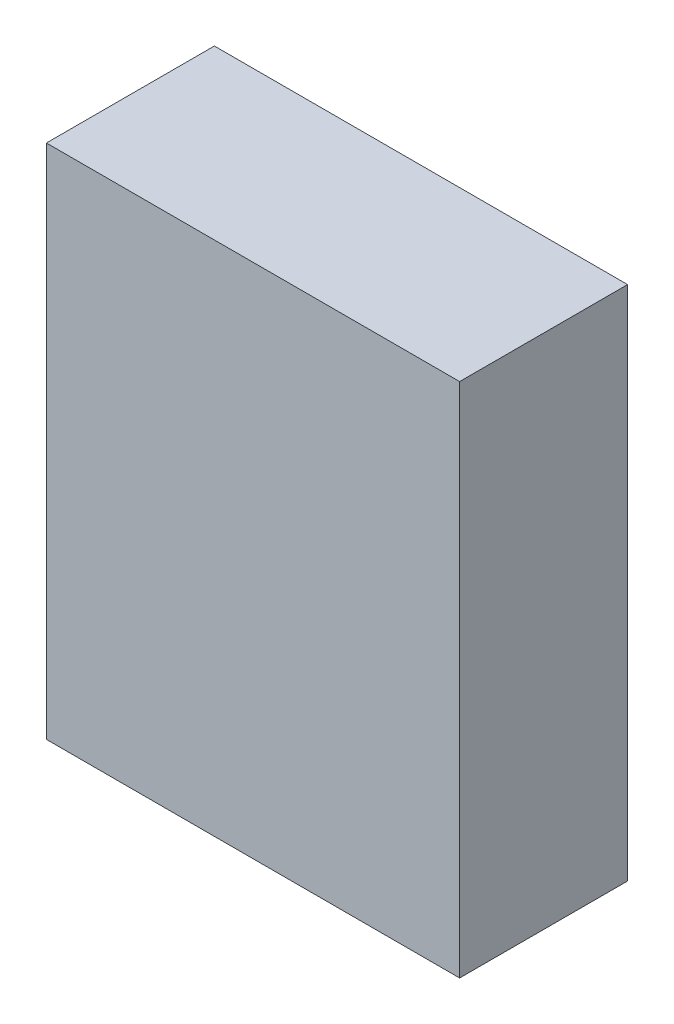
ISO-10303-21;
HEADER;
FILE_DESCRIPTION(('STEP AP214'),'2;1');
FILE_NAME('part.step','',(''),(''),'','','');
FILE_SCHEMA(('AUTOMOTIVE_DESIGN { 1 0 10303 214 1 1 1 1 }'));
ENDSEC;
DATA;
#1=APPLICATION_CONTEXT('core data for automotive mechanical design processes');
#2=APPLICATION_PROTOCOL_DEFINITION('international standard','automotive_design',2000,#1);
#3=PRODUCT_CONTEXT('',#1,'mechanical');
#4=PRODUCT('Part','Part','',(#3));
#5=PRODUCT_RELATED_PRODUCT_CATEGORY('part','',(#4));
#6=PRODUCT_DEFINITION_FORMATION('','',#4);
#7=PRODUCT_DEFINITION_CONTEXT('part definition',#1,'design');
#8=PRODUCT_DEFINITION('design','',#6,#7);
#9=PRODUCT_DEFINITION_SHAPE('','',#8);
#10=(LENGTH_UNIT() NAMED_UNIT(*) SI_UNIT(.MILLI.,.METRE.));
#11=(NAMED_UNIT(*) PLANE_ANGLE_UNIT() SI_UNIT($,.RADIAN.));
#12=(NAMED_UNIT(*) SI_UNIT($,.STERADIAN.) SOLID_ANGLE_UNIT());
#13=UNCERTAINTY_MEASURE_WITH_UNIT(LENGTH_MEASURE(1.E-05),#10,'distance_accuracy_value','');
#14=(GEOMETRIC_REPRESENTATION_CONTEXT(3) GLOBAL_UNCERTAINTY_ASSIGNED_CONTEXT((#13)) GLOBAL_UNIT_ASSIGNED_CONTEXT((#10,
#11,#12)) REPRESENTATION_CONTEXT('',''));
#15=CARTESIAN_POINT('',(0.,0.,0.));
#16=DIRECTION('',(0.,0.,1.));
#17=DIRECTION('',(1.,0.,0.));
#18=AXIS2_PLACEMENT_3D('',#15,#16,#17);
#19=CARTESIAN_POINT('',(1.23000008,1.5375001,1.00000054));
#20=DIRECTION('',(0.,0.,1.));
#21=DIRECTION('',(1.,0.,0.));
#22=AXIS2_PLACEMENT_3D('',#19,#20,#21);
#23=PLANE('',#22);
#24=DIRECTION('',(1.,0.,0.));
#25=VECTOR('',#24,1.);
#26=CARTESIAN_POINT('',(1.23000008,-1.5375001,1.00000054));
#27=LINE('',#26,#25);
#28=CARTESIAN_POINT('',(1.23000008,-1.5375001,1.00000054));
#29=VERTEX_POINT('',#28);
#30=CARTESIAN_POINT('',(-1.23000008,-1.5375001,1.00000054));
#31=VERTEX_POINT('',#30);
#32=EDGE_CURVE('E52',#29,#31,#27,.F.);
#33=ORIENTED_EDGE('',*,*,#32,.F.);
#34=DIRECTION('',(0.,1.,0.));
#35=VECTOR('',#34,1.);
#36=CARTESIAN_POINT('',(1.23000008,1.5375001,1.00000054));
#37=LINE('',#36,#35);
#38=CARTESIAN_POINT('',(1.23000008,1.5375001,1.00000054));
#39=VERTEX_POINT('',#38);
#40=EDGE_CURVE('E67',#39,#29,#37,.F.);
#41=ORIENTED_EDGE('',*,*,#40,.F.);
#42=DIRECTION('',(1.,0.,0.));
#43=VECTOR('',#42,1.);
#44=CARTESIAN_POINT('',(-1.23000008,1.5375001,1.00000054));
#45=LINE('',#44,#43);
#46=CARTESIAN_POINT('',(-1.23000008,1.5375001,1.00000054));
#47=VERTEX_POINT('',#46);
#48=EDGE_CURVE('E19',#47,#39,#45,.T.);
#49=ORIENTED_EDGE('',*,*,#48,.F.);
#50=DIRECTION('',(0.,1.,0.));
#51=VECTOR('',#50,1.);
#52=CARTESIAN_POINT('',(-1.23000008,-1.5375001,1.00000054));
#53=LINE('',#52,#51);
#54=EDGE_CURVE('E57',#31,#47,#53,.T.);
#55=ORIENTED_EDGE('',*,*,#54,.F.);
#56=EDGE_LOOP('',(#33,#41,#49,#55));
#57=FACE_BOUND('',#56,.T.);
#58=ADVANCED_FACE('F16',(#57),#23,.T.);
#59=CARTESIAN_POINT('',(-1.23000008,1.5375001,0.));
#60=DIRECTION('',(0.,1.,0.));
#61=DIRECTION('',(0.,0.,1.));
#62=AXIS2_PLACEMENT_3D('',#59,#60,#61);
#63=PLANE('',#62);
#64=DIRECTION('',(0.,0.,-1.));
#65=VECTOR('',#64,1.);
#66=CARTESIAN_POINT('',(1.23000008,1.5375001,0.));
#67=LINE('',#66,#65);
#68=CARTESIAN_POINT('',(1.23000008,1.5375001,0.));
#69=VERTEX_POINT('',#68);
#70=EDGE_CURVE('E78',#69,#39,#67,.F.);
#71=ORIENTED_EDGE('',*,*,#70,.F.);
#72=DIRECTION('',(1.,0.,0.));
#73=VECTOR('',#72,1.);
#74=CARTESIAN_POINT('',(1.23000008,1.5375001,0.));
#75=LINE('',#74,#73);
#76=CARTESIAN_POINT('',(-1.23000008,1.5375001,0.));
#77=VERTEX_POINT('',#76);
#78=EDGE_CURVE('E73',#69,#77,#75,.F.);
#79=ORIENTED_EDGE('',*,*,#78,.T.);
#80=DIRECTION('',(0.,0.,1.));
#81=VECTOR('',#80,1.);
#82=CARTESIAN_POINT('',(-1.23000008,1.5375001,0.));
#83=LINE('',#82,#81);
#84=EDGE_CURVE('E62',#47,#77,#83,.F.);
#85=ORIENTED_EDGE('',*,*,#84,.F.);
#86=ORIENTED_EDGE('',*,*,#48,.T.);
#87=EDGE_LOOP('',(#71,#79,#85,#86));
#88=FACE_BOUND('',#87,.T.);
#89=ADVANCED_FACE('F72',(#88),#63,.T.);
#90=CARTESIAN_POINT('',(-1.23000008,-1.5375001,0.));
#91=DIRECTION('',(-1.,0.,0.));
#92=DIRECTION('',(0.,0.,1.));
#93=AXIS2_PLACEMENT_3D('',#90,#91,#92);
#94=PLANE('',#93);
#95=ORIENTED_EDGE('',*,*,#84,.T.);
#96=DIRECTION('',(0.,1.,0.));
#97=VECTOR('',#96,1.);
#98=CARTESIAN_POINT('',(-1.23000008,1.5375001,0.));
#99=LINE('',#98,#97);
#100=CARTESIAN_POINT('',(-1.23000008,-1.5375001,0.));
#101=VERTEX_POINT('',#100);
#102=EDGE_CURVE('E83',#77,#101,#99,.F.);
#103=ORIENTED_EDGE('',*,*,#102,.T.);
#104=DIRECTION('',(0.,0.,-1.));
#105=VECTOR('',#104,1.);
#106=CARTESIAN_POINT('',(-1.23000008,-1.5375001,0.));
#107=LINE('',#106,#105);
#108=EDGE_CURVE('E64',#31,#101,#107,.T.);
#109=ORIENTED_EDGE('',*,*,#108,.F.);
#110=ORIENTED_EDGE('',*,*,#54,.T.);
#111=EDGE_LOOP('',(#95,#103,#109,#110));
#112=FACE_BOUND('',#111,.T.);
#113=ADVANCED_FACE('F59',(#112),#94,.T.);
#114=CARTESIAN_POINT('',(1.23000008,-1.5375001,0.));
#115=DIRECTION('',(0.,-1.,0.));
#116=DIRECTION('',(0.,0.,-1.));
#117=AXIS2_PLACEMENT_3D('',#114,#115,#116);
#118=PLANE('',#117);
#119=ORIENTED_EDGE('',*,*,#108,.T.);
#120=DIRECTION('',(1.,0.,0.));
#121=VECTOR('',#120,1.);
#122=CARTESIAN_POINT('',(1.23000008,-1.5375001,0.));
#123=LINE('',#122,#121);
#124=CARTESIAN_POINT('',(1.23000008,-1.5375001,0.));
#125=VERTEX_POINT('',#124);
#126=EDGE_CURVE('E25',#101,#125,#123,.T.);
#127=ORIENTED_EDGE('',*,*,#126,.T.);
#128=DIRECTION('',(0.,0.,-1.));
#129=VECTOR('',#128,1.);
#130=CARTESIAN_POINT('',(1.23000008,-1.5375001,0.));
#131=LINE('',#130,#129);
#132=EDGE_CURVE('E33',#29,#125,#131,.T.);
#133=ORIENTED_EDGE('',*,*,#132,.F.);
#134=ORIENTED_EDGE('',*,*,#32,.T.);
#135=EDGE_LOOP('',(#119,#127,#133,#134));
#136=FACE_BOUND('',#135,.T.);
#137=ADVANCED_FACE('F87',(#136),#118,.T.);
#138=CARTESIAN_POINT('',(1.23000008,1.5375001,0.));
#139=DIRECTION('',(1.,0.,0.));
#140=DIRECTION('',(0.,0.,-1.));
#141=AXIS2_PLACEMENT_3D('',#138,#139,#140);
#142=PLANE('',#141);
#143=ORIENTED_EDGE('',*,*,#132,.T.);
#144=DIRECTION('',(0.,1.,0.));
#145=VECTOR('',#144,1.);
#146=CARTESIAN_POINT('',(1.23000008,1.5375001,0.));
#147=LINE('',#146,#145);
#148=EDGE_CURVE('E11',#125,#69,#147,.T.);
#149=ORIENTED_EDGE('',*,*,#148,.T.);
#150=ORIENTED_EDGE('',*,*,#70,.T.);
#151=ORIENTED_EDGE('',*,*,#40,.T.);
#152=EDGE_LOOP('',(#143,#149,#150,#151));
#153=FACE_BOUND('',#152,.T.);
#154=ADVANCED_FACE('F90',(#153),#142,.T.);
#155=CARTESIAN_POINT('',(1.23000008,1.5375001,0.));
#156=DIRECTION('',(0.,0.,1.));
#157=DIRECTION('',(1.,0.,0.));
#158=AXIS2_PLACEMENT_3D('',#155,#156,#157);
#159=PLANE('',#158);
#160=ORIENTED_EDGE('',*,*,#126,.F.);
#161=ORIENTED_EDGE('',*,*,#102,.F.);
#162=ORIENTED_EDGE('',*,*,#78,.F.);
#163=ORIENTED_EDGE('',*,*,#148,.F.);
#164=EDGE_LOOP('',(#160,#161,#162,#163));
#165=FACE_BOUND('',#164,.T.);
#166=ADVANCED_FACE('F89',(#165),#159,.F.);
#167=CLOSED_SHELL('',(#58,#89,#113,#137,#154,#166));
#168=MANIFOLD_SOLID_BREP('B1',#167);
#169=ADVANCED_BREP_SHAPE_REPRESENTATION('',(#18,#168),#14);
#170=SHAPE_DEFINITION_REPRESENTATION(#9,#169);
ENDSEC;
END-ISO-10303-21;
